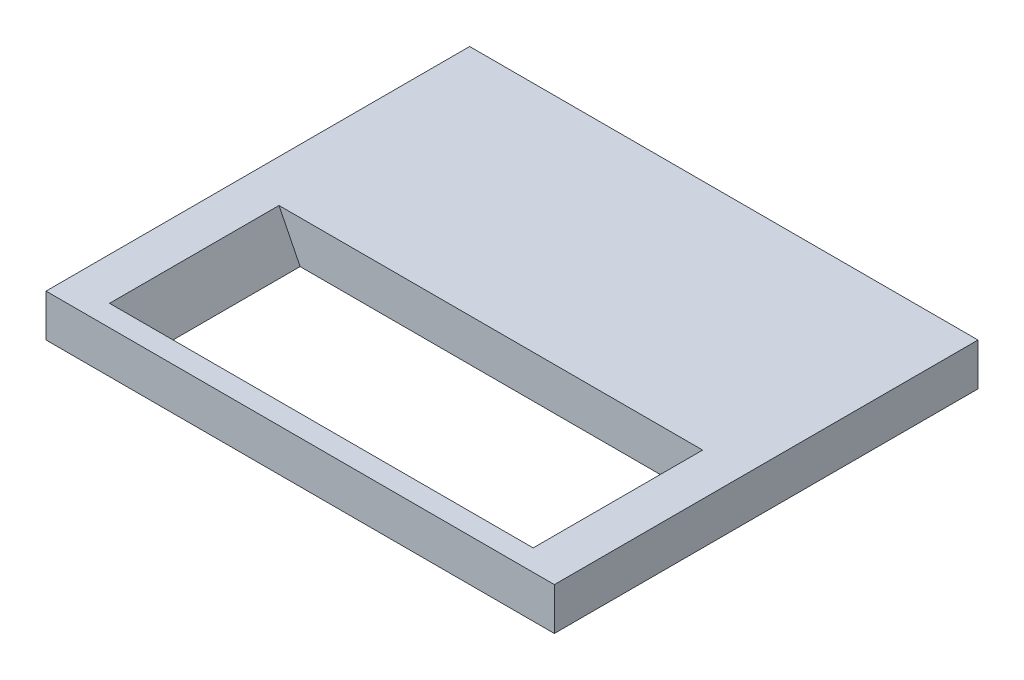
ISO-10303-21;
HEADER;
FILE_DESCRIPTION(('STEP AP214'),'2;1');
FILE_NAME('part.step','',(''),(''),'','','');
FILE_SCHEMA(('AUTOMOTIVE_DESIGN { 1 0 10303 214 1 1 1 1 }'));
ENDSEC;
DATA;
#1=APPLICATION_CONTEXT('core data for automotive mechanical design processes');
#2=APPLICATION_PROTOCOL_DEFINITION('international standard','automotive_design',2000,#1);
#3=PRODUCT_CONTEXT('',#1,'mechanical');
#4=PRODUCT('Part','Part','',(#3));
#5=PRODUCT_RELATED_PRODUCT_CATEGORY('part','',(#4));
#6=PRODUCT_DEFINITION_FORMATION('','',#4);
#7=PRODUCT_DEFINITION_CONTEXT('part definition',#1,'design');
#8=PRODUCT_DEFINITION('design','',#6,#7);
#9=PRODUCT_DEFINITION_SHAPE('','',#8);
#10=(LENGTH_UNIT() NAMED_UNIT(*) SI_UNIT(.MILLI.,.METRE.));
#11=(NAMED_UNIT(*) PLANE_ANGLE_UNIT() SI_UNIT($,.RADIAN.));
#12=(NAMED_UNIT(*) SI_UNIT($,.STERADIAN.) SOLID_ANGLE_UNIT());
#13=UNCERTAINTY_MEASURE_WITH_UNIT(LENGTH_MEASURE(1.E-05),#10,'distance_accuracy_value','');
#14=(GEOMETRIC_REPRESENTATION_CONTEXT(3) GLOBAL_UNCERTAINTY_ASSIGNED_CONTEXT((#13)) GLOBAL_UNIT_ASSIGNED_CONTEXT((#10,
#11,#12)) REPRESENTATION_CONTEXT('',''));
#15=CARTESIAN_POINT('',(0.,0.,0.));
#16=DIRECTION('',(0.,0.,1.));
#17=DIRECTION('',(1.,0.,0.));
#18=AXIS2_PLACEMENT_3D('',#15,#16,#17);
#19=CARTESIAN_POINT('',(0.,-10.,0.));
#20=DIRECTION('',(0.,1.,0.));
#21=DIRECTION('',(0.,0.,1.));
#22=AXIS2_PLACEMENT_3D('',#19,#20,#21);
#23=PLANE('',#22);
#24=DIRECTION('',(-1.,0.,0.));
#25=VECTOR('',#24,1.);
#26=CARTESIAN_POINT('',(0.,-10.,-28.));
#27=LINE('',#26,#25);
#28=CARTESIAN_POINT('',(48.,-10.,-28.));
#29=VERTEX_POINT('',#28);
#30=CARTESIAN_POINT('',(42.,-10.,-28.));
#31=VERTEX_POINT('',#30);
#32=EDGE_CURVE('E764',#29,#31,#27,.T.);
#33=ORIENTED_EDGE('',*,*,#32,.T.);
#34=DIRECTION('',(0.,0.,-1.));
#35=VECTOR('',#34,1.);
#36=CARTESIAN_POINT('',(42.,-10.,0.));
#37=LINE('',#36,#35);
#38=CARTESIAN_POINT('',(42.,-10.,-22.));
#39=VERTEX_POINT('',#38);
#40=EDGE_CURVE('E751',#39,#31,#37,.T.);
#41=ORIENTED_EDGE('',*,*,#40,.F.);
#42=DIRECTION('',(-1.,0.,0.));
#43=VECTOR('',#42,1.);
#44=CARTESIAN_POINT('',(0.,-10.,-22.));
#45=LINE('',#44,#43);
#46=CARTESIAN_POINT('',(48.,-10.,-22.));
#47=VERTEX_POINT('',#46);
#48=EDGE_CURVE('E755',#47,#39,#45,.T.);
#49=ORIENTED_EDGE('',*,*,#48,.F.);
#50=DIRECTION('',(0.,0.,-1.));
#51=VECTOR('',#50,1.);
#52=CARTESIAN_POINT('',(48.,-10.,0.));
#53=LINE('',#52,#51);
#54=EDGE_CURVE('E760',#47,#29,#53,.T.);
#55=ORIENTED_EDGE('',*,*,#54,.T.);
#56=EDGE_LOOP('',(#33,#41,#49,#55));
#57=FACE_BOUND('',#56,.T.);
#58=DIRECTION('',(1.,0.,0.));
#59=VECTOR('',#58,1.);
#60=CARTESIAN_POINT('',(0.,-10.,4.));
#61=LINE('',#60,#59);
#62=CARTESIAN_POINT('',(-49.,-10.,4.));
#63=VERTEX_POINT('',#62);
#64=CARTESIAN_POINT('',(-46.,-10.,4.));
#65=VERTEX_POINT('',#64);
#66=EDGE_CURVE('E849',#63,#65,#61,.T.);
#67=ORIENTED_EDGE('',*,*,#66,.T.);
#68=DIRECTION('',(0.,0.,-1.));
#69=VECTOR('',#68,1.);
#70=CARTESIAN_POINT('',(-46.,-10.,0.));
#71=LINE('',#70,#69);
#72=CARTESIAN_POINT('',(-46.,-10.,0.999999999999994));
#73=VERTEX_POINT('',#72);
#74=EDGE_CURVE('E836',#65,#73,#71,.T.);
#75=ORIENTED_EDGE('',*,*,#74,.T.);
#76=DIRECTION('',(1.,0.,0.));
#77=VECTOR('',#76,1.);
#78=CARTESIAN_POINT('',(0.,-10.,0.999999999999994));
#79=LINE('',#78,#77);
#80=CARTESIAN_POINT('',(-49.,-10.,0.999999999999994));
#81=VERTEX_POINT('',#80);
#82=EDGE_CURVE('E840',#81,#73,#79,.T.);
#83=ORIENTED_EDGE('',*,*,#82,.F.);
#84=DIRECTION('',(0.,0.,-1.));
#85=VECTOR('',#84,1.);
#86=CARTESIAN_POINT('',(-49.,-10.,0.));
#87=LINE('',#86,#85);
#88=EDGE_CURVE('E845',#63,#81,#87,.T.);
#89=ORIENTED_EDGE('',*,*,#88,.F.);
#90=EDGE_LOOP('',(#67,#75,#83,#89));
#91=FACE_BOUND('',#90,.T.);
#92=DIRECTION('',(1.,0.,0.));
#93=VECTOR('',#92,1.);
#94=CARTESIAN_POINT('',(-48.,-10.,-28.));
#95=LINE('',#94,#93);
#96=CARTESIAN_POINT('',(-48.,-10.,-28.));
#97=VERTEX_POINT('',#96);
#98=CARTESIAN_POINT('',(-42.,-10.,-28.));
#99=VERTEX_POINT('',#98);
#100=EDGE_CURVE('E711',#97,#99,#95,.T.);
#101=ORIENTED_EDGE('',*,*,#100,.F.);
#102=DIRECTION('',(0.,0.,-1.));
#103=VECTOR('',#102,1.);
#104=CARTESIAN_POINT('',(-48.,-10.,-22.));
#105=LINE('',#104,#103);
#106=CARTESIAN_POINT('',(-48.,-10.,-22.));
#107=VERTEX_POINT('',#106);
#108=EDGE_CURVE('E689',#107,#97,#105,.T.);
#109=ORIENTED_EDGE('',*,*,#108,.F.);
#110=DIRECTION('',(1.,0.,0.));
#111=VECTOR('',#110,1.);
#112=CARTESIAN_POINT('',(-48.,-10.,-22.));
#113=LINE('',#112,#111);
#114=CARTESIAN_POINT('',(-42.,-10.,-22.));
#115=VERTEX_POINT('',#114);
#116=EDGE_CURVE('E699',#107,#115,#113,.T.);
#117=ORIENTED_EDGE('',*,*,#116,.T.);
#118=DIRECTION('',(0.,0.,-1.));
#119=VECTOR('',#118,1.);
#120=CARTESIAN_POINT('',(-42.,-10.,-22.));
#121=LINE('',#120,#119);
#122=EDGE_CURVE('E706',#115,#99,#121,.T.);
#123=ORIENTED_EDGE('',*,*,#122,.T.);
#124=EDGE_LOOP('',(#101,#109,#117,#123));
#125=FACE_BOUND('',#124,.T.);
#126=DIRECTION('',(0.,0.,-1.));
#127=VECTOR('',#126,1.);
#128=CARTESIAN_POINT('',(-45.0141839194658,-10.,0.));
#129=LINE('',#128,#127);
#130=CARTESIAN_POINT('',(-45.0141839194658,-10.,4.99999999999999));
#131=VERTEX_POINT('',#130);
#132=CARTESIAN_POINT('',(-45.0141839194658,-10.,45.));
#133=VERTEX_POINT('',#132);
#134=EDGE_CURVE('E996',#131,#133,#129,.F.);
#135=ORIENTED_EDGE('',*,*,#134,.T.);
#136=DIRECTION('',(-1.,0.,0.));
#137=VECTOR('',#136,1.);
#138=CARTESIAN_POINT('',(0.,-10.,45.));
#139=LINE('',#138,#137);
#140=CARTESIAN_POINT('',(45.,-10.,45.));
#141=VERTEX_POINT('',#140);
#142=EDGE_CURVE('E955',#141,#133,#139,.T.);
#143=ORIENTED_EDGE('',*,*,#142,.F.);
#144=DIRECTION('',(0.,0.,1.));
#145=VECTOR('',#144,1.);
#146=CARTESIAN_POINT('',(45.,-10.,0.));
#147=LINE('',#146,#145);
#148=CARTESIAN_POINT('',(45.,-10.,4.99999999999999));
#149=VERTEX_POINT('',#148);
#150=EDGE_CURVE('E961',#149,#141,#147,.T.);
#151=ORIENTED_EDGE('',*,*,#150,.F.);
#152=DIRECTION('',(1.,0.,0.));
#153=VECTOR('',#152,1.);
#154=CARTESIAN_POINT('',(0.,-10.,4.99999999999999));
#155=LINE('',#154,#153);
#156=EDGE_CURVE('E943',#131,#149,#155,.T.);
#157=ORIENTED_EDGE('',*,*,#156,.F.);
#158=EDGE_LOOP('',(#135,#143,#151,#157));
#159=FACE_BOUND('',#158,.T.);
#160=DIRECTION('',(1.,0.,0.));
#161=VECTOR('',#160,1.);
#162=CARTESIAN_POINT('',(0.,-10.,50.));
#163=LINE('',#162,#161);
#164=CARTESIAN_POINT('',(-60.,-10.,50.));
#165=VERTEX_POINT('',#164);
#166=CARTESIAN_POINT('',(60.,-10.,50.));
#167=VERTEX_POINT('',#166);
#168=EDGE_CURVE('E970',#165,#167,#163,.T.);
#169=ORIENTED_EDGE('',*,*,#168,.F.);
#170=DIRECTION('',(0.,0.,1.));
#171=VECTOR('',#170,1.);
#172=CARTESIAN_POINT('',(-60.,-10.,0.));
#173=LINE('',#172,#171);
#174=CARTESIAN_POINT('',(-60.,-10.,-50.));
#175=VERTEX_POINT('',#174);
#176=EDGE_CURVE('E967',#175,#165,#173,.T.);
#177=ORIENTED_EDGE('',*,*,#176,.F.);
#178=DIRECTION('',(1.,0.,0.));
#179=VECTOR('',#178,1.);
#180=CARTESIAN_POINT('',(0.,-10.,-50.));
#181=LINE('',#180,#179);
#182=CARTESIAN_POINT('',(60.,-10.,-50.));
#183=VERTEX_POINT('',#182);
#184=EDGE_CURVE('E978',#175,#183,#181,.T.);
#185=ORIENTED_EDGE('',*,*,#184,.T.);
#186=DIRECTION('',(0.,0.,1.));
#187=VECTOR('',#186,1.);
#188=CARTESIAN_POINT('',(60.,-10.,0.));
#189=LINE('',#188,#187);
#190=EDGE_CURVE('E975',#183,#167,#189,.T.);
#191=ORIENTED_EDGE('',*,*,#190,.T.);
#192=EDGE_LOOP('',(#169,#177,#185,#191));
#193=FACE_BOUND('',#192,.T.);
#194=DIRECTION('',(-1.,0.,0.));
#195=VECTOR('',#194,1.);
#196=CARTESIAN_POINT('',(0.,-10.,45.9999999999999));
#197=LINE('',#196,#195);
#198=CARTESIAN_POINT('',(49.0000000000001,-10.,45.9999999999999));
#199=VERTEX_POINT('',#198);
#200=CARTESIAN_POINT('',(46.0000000000001,-10.,45.9999999999999));
#201=VERTEX_POINT('',#200);
#202=EDGE_CURVE('E853',#199,#201,#197,.T.);
#203=ORIENTED_EDGE('',*,*,#202,.T.);
#204=DIRECTION('',(0.,0.,1.));
#205=VECTOR('',#204,1.);
#206=CARTESIAN_POINT('',(46.0000000000001,-10.,0.));
#207=LINE('',#206,#205);
#208=CARTESIAN_POINT('',(46.0000000000001,-10.,48.9999999999999));
#209=VERTEX_POINT('',#208);
#210=EDGE_CURVE('E913',#201,#209,#207,.T.);
#211=ORIENTED_EDGE('',*,*,#210,.T.);
#212=DIRECTION('',(-1.,0.,0.));
#213=VECTOR('',#212,1.);
#214=CARTESIAN_POINT('',(0.,-10.,48.9999999999999));
#215=LINE('',#214,#213);
#216=CARTESIAN_POINT('',(49.0000000000001,-10.,48.9999999999999));
#217=VERTEX_POINT('',#216);
#218=EDGE_CURVE('E932',#217,#209,#215,.T.);
#219=ORIENTED_EDGE('',*,*,#218,.F.);
#220=DIRECTION('',(0.,0.,1.));
#221=VECTOR('',#220,1.);
#222=CARTESIAN_POINT('',(49.0000000000001,-10.,0.));
#223=LINE('',#222,#221);
#224=EDGE_CURVE('E928',#199,#217,#223,.T.);
#225=ORIENTED_EDGE('',*,*,#224,.F.);
#226=EDGE_LOOP('',(#203,#211,#219,#225));
#227=FACE_BOUND('',#226,.T.);
#228=DIRECTION('',(-1.,0.,0.));
#229=VECTOR('',#228,1.);
#230=CARTESIAN_POINT('',(0.,-10.,1.00000000000008));
#231=LINE('',#230,#229);
#232=CARTESIAN_POINT('',(49.0000000000001,-10.,1.00000000000008));
#233=VERTEX_POINT('',#232);
#234=CARTESIAN_POINT('',(46.0000000000001,-10.,1.00000000000008));
#235=VERTEX_POINT('',#234);
#236=EDGE_CURVE('E835',#233,#235,#231,.T.);
#237=ORIENTED_EDGE('',*,*,#236,.T.);
#238=DIRECTION('',(0.,0.,-1.));
#239=VECTOR('',#238,1.);
#240=CARTESIAN_POINT('',(46.0000000000001,-10.,0.));
#241=LINE('',#240,#239);
#242=CARTESIAN_POINT('',(46.0000000000001,-10.,4.00000000000008));
#243=VERTEX_POINT('',#242);
#244=EDGE_CURVE('E880',#243,#235,#241,.T.);
#245=ORIENTED_EDGE('',*,*,#244,.F.);
#246=DIRECTION('',(-1.,0.,0.));
#247=VECTOR('',#246,1.);
#248=CARTESIAN_POINT('',(0.,-10.,4.00000000000008));
#249=LINE('',#248,#247);
#250=CARTESIAN_POINT('',(49.0000000000001,-10.,4.00000000000008));
#251=VERTEX_POINT('',#250);
#252=EDGE_CURVE('E884',#251,#243,#249,.T.);
#253=ORIENTED_EDGE('',*,*,#252,.F.);
#254=DIRECTION('',(0.,0.,-1.));
#255=VECTOR('',#254,1.);
#256=CARTESIAN_POINT('',(49.0000000000001,-10.,0.));
#257=LINE('',#256,#255);
#258=EDGE_CURVE('E889',#251,#233,#257,.T.);
#259=ORIENTED_EDGE('',*,*,#258,.T.);
#260=EDGE_LOOP('',(#237,#245,#253,#259));
#261=FACE_BOUND('',#260,.T.);
#262=DIRECTION('',(0.,0.,1.));
#263=VECTOR('',#262,1.);
#264=CARTESIAN_POINT('',(-49.,-10.,46.));
#265=LINE('',#264,#263);
#266=CARTESIAN_POINT('',(-49.,-10.,46.));
#267=VERTEX_POINT('',#266);
#268=CARTESIAN_POINT('',(-49.,-10.,49.));
#269=VERTEX_POINT('',#268);
#270=EDGE_CURVE('E750',#267,#269,#265,.T.);
#271=ORIENTED_EDGE('',*,*,#270,.T.);
#272=DIRECTION('',(1.,0.,0.));
#273=VECTOR('',#272,1.);
#274=CARTESIAN_POINT('',(-49.,-10.,49.));
#275=LINE('',#274,#273);
#276=CARTESIAN_POINT('',(-46.,-10.,49.));
#277=VERTEX_POINT('',#276);
#278=EDGE_CURVE('E800',#269,#277,#275,.T.);
#279=ORIENTED_EDGE('',*,*,#278,.T.);
#280=DIRECTION('',(0.,0.,1.));
#281=VECTOR('',#280,1.);
#282=CARTESIAN_POINT('',(-46.,-10.,46.));
#283=LINE('',#282,#281);
#284=CARTESIAN_POINT('',(-46.,-10.,46.));
#285=VERTEX_POINT('',#284);
#286=EDGE_CURVE('E795',#285,#277,#283,.T.);
#287=ORIENTED_EDGE('',*,*,#286,.F.);
#288=DIRECTION('',(1.,0.,0.));
#289=VECTOR('',#288,1.);
#290=CARTESIAN_POINT('',(-49.,-10.,46.));
#291=LINE('',#290,#289);
#292=EDGE_CURVE('E791',#267,#285,#291,.T.);
#293=ORIENTED_EDGE('',*,*,#292,.F.);
#294=EDGE_LOOP('',(#271,#279,#287,#293));
#295=FACE_BOUND('',#294,.T.);
#296=ADVANCED_FACE('F475',(#57,#91,#125,#159,#193,#227,#261,#295),#23,.F.);
#297=CARTESIAN_POINT('',(0.,0.,0.));
#298=DIRECTION('',(0.,1.,0.));
#299=DIRECTION('',(0.,0.,1.));
#300=AXIS2_PLACEMENT_3D('',#297,#298,#299);
#301=PLANE('',#300);
#302=DIRECTION('',(0.,0.,1.));
#303=VECTOR('',#302,1.);
#304=CARTESIAN_POINT('',(-60.,0.,0.));
#305=LINE('',#304,#303);
#306=CARTESIAN_POINT('',(-60.,0.,-50.));
#307=VERTEX_POINT('',#306);
#308=CARTESIAN_POINT('',(-60.,0.,50.));
#309=VERTEX_POINT('',#308);
#310=EDGE_CURVE('E958',#307,#309,#305,.T.);
#311=ORIENTED_EDGE('',*,*,#310,.T.);
#312=DIRECTION('',(1.,0.,0.));
#313=VECTOR('',#312,1.);
#314=CARTESIAN_POINT('',(0.,0.,50.));
#315=LINE('',#314,#313);
#316=CARTESIAN_POINT('',(60.,0.,50.));
#317=VERTEX_POINT('',#316);
#318=EDGE_CURVE('E984',#309,#317,#315,.T.);
#319=ORIENTED_EDGE('',*,*,#318,.T.);
#320=DIRECTION('',(0.,0.,1.));
#321=VECTOR('',#320,1.);
#322=CARTESIAN_POINT('',(60.,0.,0.));
#323=LINE('',#322,#321);
#324=CARTESIAN_POINT('',(60.,0.,-50.));
#325=VERTEX_POINT('',#324);
#326=EDGE_CURVE('E987',#325,#317,#323,.T.);
#327=ORIENTED_EDGE('',*,*,#326,.F.);
#328=DIRECTION('',(1.,0.,0.));
#329=VECTOR('',#328,1.);
#330=CARTESIAN_POINT('',(0.,0.,-50.));
#331=LINE('',#330,#329);
#332=EDGE_CURVE('E971',#307,#325,#331,.T.);
#333=ORIENTED_EDGE('',*,*,#332,.F.);
#334=EDGE_LOOP('',(#311,#319,#327,#333));
#335=FACE_BOUND('',#334,.T.);
#336=DIRECTION('',(0.,0.,1.));
#337=VECTOR('',#336,1.);
#338=CARTESIAN_POINT('',(49.9999888348986,0.,45.));
#339=LINE('',#338,#337);
#340=CARTESIAN_POINT('',(49.9999888348986,0.,4.99999999999999));
#341=VERTEX_POINT('',#340);
#342=CARTESIAN_POINT('',(49.9999888348986,0.,45.));
#343=VERTEX_POINT('',#342);
#344=EDGE_CURVE('E1021',#341,#343,#339,.T.);
#345=ORIENTED_EDGE('',*,*,#344,.T.);
#346=DIRECTION('',(-1.,0.,0.));
#347=VECTOR('',#346,1.);
#348=CARTESIAN_POINT('',(0.,0.,45.));
#349=LINE('',#348,#347);
#350=CARTESIAN_POINT('',(-50.0000000000001,0.,45.));
#351=VERTEX_POINT('',#350);
#352=EDGE_CURVE('E492',#343,#351,#349,.T.);
#353=ORIENTED_EDGE('',*,*,#352,.T.);
#354=DIRECTION('',(0.,0.,-1.));
#355=VECTOR('',#354,1.);
#356=CARTESIAN_POINT('',(-50.0000000000001,0.,0.));
#357=LINE('',#356,#355);
#358=CARTESIAN_POINT('',(-50.0000000000001,0.,4.99999999999999));
#359=VERTEX_POINT('',#358);
#360=EDGE_CURVE('E1011',#351,#359,#357,.T.);
#361=ORIENTED_EDGE('',*,*,#360,.T.);
#362=DIRECTION('',(1.,0.,0.));
#363=VECTOR('',#362,1.);
#364=CARTESIAN_POINT('',(0.,0.,4.99999999999999));
#365=LINE('',#364,#363);
#366=EDGE_CURVE('E500',#359,#341,#365,.T.);
#367=ORIENTED_EDGE('',*,*,#366,.T.);
#368=EDGE_LOOP('',(#345,#353,#361,#367));
#369=FACE_BOUND('',#368,.T.);
#370=ADVANCED_FACE('F1039',(#335,#369),#301,.T.);
#371=CARTESIAN_POINT('',(0.,-10.,-50.));
#372=DIRECTION('',(0.,0.,1.));
#373=DIRECTION('',(1.,0.,0.));
#374=AXIS2_PLACEMENT_3D('',#371,#372,#373);
#375=PLANE('',#374);
#376=ORIENTED_EDGE('',*,*,#332,.T.);
#377=DIRECTION('',(0.,1.,0.));
#378=VECTOR('',#377,1.);
#379=CARTESIAN_POINT('',(60.,-10.,-50.));
#380=LINE('',#379,#378);
#381=EDGE_CURVE('E997',#183,#325,#380,.T.);
#382=ORIENTED_EDGE('',*,*,#381,.F.);
#383=ORIENTED_EDGE('',*,*,#184,.F.);
#384=DIRECTION('',(0.,1.,0.));
#385=VECTOR('',#384,1.);
#386=CARTESIAN_POINT('',(-60.,-10.,-50.));
#387=LINE('',#386,#385);
#388=EDGE_CURVE('E993',#175,#307,#387,.T.);
#389=ORIENTED_EDGE('',*,*,#388,.T.);
#390=EDGE_LOOP('',(#376,#382,#383,#389));
#391=FACE_BOUND('',#390,.T.);
#392=ADVANCED_FACE('F1041',(#391),#375,.F.);
#393=CARTESIAN_POINT('',(-60.,-10.,0.));
#394=DIRECTION('',(-1.,0.,0.));
#395=DIRECTION('',(0.,0.,1.));
#396=AXIS2_PLACEMENT_3D('',#393,#394,#395);
#397=PLANE('',#396);
#398=DIRECTION('',(0.,1.,0.));
#399=VECTOR('',#398,1.);
#400=CARTESIAN_POINT('',(-60.,-10.,50.));
#401=LINE('',#400,#399);
#402=EDGE_CURVE('E981',#165,#309,#401,.T.);
#403=ORIENTED_EDGE('',*,*,#402,.T.);
#404=ORIENTED_EDGE('',*,*,#310,.F.);
#405=ORIENTED_EDGE('',*,*,#388,.F.);
#406=ORIENTED_EDGE('',*,*,#176,.T.);
#407=EDGE_LOOP('',(#403,#404,#405,#406));
#408=FACE_BOUND('',#407,.T.);
#409=ADVANCED_FACE('F1048',(#408),#397,.T.);
#410=CARTESIAN_POINT('',(60.,-10.,0.));
#411=DIRECTION('',(-1.,0.,0.));
#412=DIRECTION('',(0.,0.,1.));
#413=AXIS2_PLACEMENT_3D('',#410,#411,#412);
#414=PLANE('',#413);
#415=DIRECTION('',(0.,1.,0.));
#416=VECTOR('',#415,1.);
#417=CARTESIAN_POINT('',(60.,-10.,50.));
#418=LINE('',#417,#416);
#419=EDGE_CURVE('E1001',#167,#317,#418,.T.);
#420=ORIENTED_EDGE('',*,*,#419,.F.);
#421=ORIENTED_EDGE('',*,*,#190,.F.);
#422=ORIENTED_EDGE('',*,*,#381,.T.);
#423=ORIENTED_EDGE('',*,*,#326,.T.);
#424=EDGE_LOOP('',(#420,#421,#422,#423));
#425=FACE_BOUND('',#424,.T.);
#426=ADVANCED_FACE('F1055',(#425),#414,.F.);
#427=CARTESIAN_POINT('',(0.,-10.,50.));
#428=DIRECTION('',(0.,0.,1.));
#429=DIRECTION('',(1.,0.,0.));
#430=AXIS2_PLACEMENT_3D('',#427,#428,#429);
#431=PLANE('',#430);
#432=ORIENTED_EDGE('',*,*,#419,.T.);
#433=ORIENTED_EDGE('',*,*,#318,.F.);
#434=ORIENTED_EDGE('',*,*,#402,.F.);
#435=ORIENTED_EDGE('',*,*,#168,.T.);
#436=EDGE_LOOP('',(#432,#433,#434,#435));
#437=FACE_BOUND('',#436,.T.);
#438=ADVANCED_FACE('F1058',(#437),#431,.T.);
#439=CARTESIAN_POINT('',(0.,0.,45.));
#440=DIRECTION('',(0.,0.,1.));
#441=DIRECTION('',(1.,0.,0.));
#442=AXIS2_PLACEMENT_3D('',#439,#440,#441);
#443=PLANE('',#442);
#444=ORIENTED_EDGE('',*,*,#142,.T.);
#445=DIRECTION('',(0.446197813109805,-0.894934361602027,0.));
#446=VECTOR('',#445,1.);
#447=CARTESIAN_POINT('',(-40.0453755788014,-19.9658877511822,45.));
#448=LINE('',#447,#446);
#449=EDGE_CURVE('E1014',#133,#351,#448,.F.);
#450=ORIENTED_EDGE('',*,*,#449,.T.);
#451=ORIENTED_EDGE('',*,*,#352,.F.);
#452=DIRECTION('',(-0.447212796589796,-0.894427590454551,0.));
#453=VECTOR('',#452,1.);
#454=CARTESIAN_POINT('',(40.0000267962276,-19.9999687376781,45.));
#455=LINE('',#454,#453);
#456=EDGE_CURVE('E485',#343,#141,#455,.T.);
#457=ORIENTED_EDGE('',*,*,#456,.T.);
#458=EDGE_LOOP('',(#444,#450,#451,#457));
#459=FACE_BOUND('',#458,.T.);
#460=ADVANCED_FACE('F1025',(#459),#443,.F.);
#461=CARTESIAN_POINT('',(0.,0.,4.99999999999999));
#462=DIRECTION('',(0.,0.,-1.));
#463=DIRECTION('',(-1.,0.,0.));
#464=AXIS2_PLACEMENT_3D('',#461,#462,#463);
#465=PLANE('',#464);
#466=ORIENTED_EDGE('',*,*,#156,.T.);
#467=DIRECTION('',(0.447212796589796,0.894427590454551,0.));
#468=VECTOR('',#467,1.);
#469=CARTESIAN_POINT('',(40.0000267962276,-19.9999687376781,4.99999999999999));
#470=LINE('',#469,#468);
#471=EDGE_CURVE('E12',#149,#341,#470,.T.);
#472=ORIENTED_EDGE('',*,*,#471,.T.);
#473=ORIENTED_EDGE('',*,*,#366,.F.);
#474=DIRECTION('',(-0.446197813109805,0.894934361602027,0.));
#475=VECTOR('',#474,1.);
#476=CARTESIAN_POINT('',(-40.0453755788014,-19.9658877511822,4.99999999999999));
#477=LINE('',#476,#475);
#478=EDGE_CURVE('E1017',#359,#131,#477,.F.);
#479=ORIENTED_EDGE('',*,*,#478,.T.);
#480=EDGE_LOOP('',(#466,#472,#473,#479));
#481=FACE_BOUND('',#480,.T.);
#482=ADVANCED_FACE('F1034',(#481),#465,.F.);
#483=CARTESIAN_POINT('',(0.,-4.,45.9999999999999));
#484=DIRECTION('',(0.,0.,1.));
#485=DIRECTION('',(1.,0.,0.));
#486=AXIS2_PLACEMENT_3D('',#483,#484,#485);
#487=PLANE('',#486);
#488=ORIENTED_EDGE('',*,*,#202,.F.);
#489=DIRECTION('',(0.,-1.,0.));
#490=VECTOR('',#489,1.);
#491=CARTESIAN_POINT('',(49.0000000000001,-4.,45.9999999999999));
#492=LINE('',#491,#490);
#493=CARTESIAN_POINT('',(49.0000000000001,-4.,45.9999999999999));
#494=VERTEX_POINT('',#493);
#495=EDGE_CURVE('E924',#494,#199,#492,.T.);
#496=ORIENTED_EDGE('',*,*,#495,.F.);
#497=DIRECTION('',(-1.,0.,0.));
#498=VECTOR('',#497,1.);
#499=CARTESIAN_POINT('',(0.,-4.,45.9999999999999));
#500=LINE('',#499,#498);
#501=CARTESIAN_POINT('',(46.0000000000001,-4.,45.9999999999999));
#502=VERTEX_POINT('',#501);
#503=EDGE_CURVE('E908',#494,#502,#500,.T.);
#504=ORIENTED_EDGE('',*,*,#503,.T.);
#505=DIRECTION('',(0.,-1.,0.));
#506=VECTOR('',#505,1.);
#507=CARTESIAN_POINT('',(46.0000000000001,-4.,45.9999999999999));
#508=LINE('',#507,#506);
#509=EDGE_CURVE('E939',#502,#201,#508,.T.);
#510=ORIENTED_EDGE('',*,*,#509,.T.);
#511=EDGE_LOOP('',(#488,#496,#504,#510));
#512=FACE_BOUND('',#511,.T.);
#513=ADVANCED_FACE('F1137',(#512),#487,.T.);
#514=CARTESIAN_POINT('',(46.0000000000001,-4.,0.));
#515=DIRECTION('',(1.,0.,0.));
#516=DIRECTION('',(0.,0.,-1.));
#517=AXIS2_PLACEMENT_3D('',#514,#515,#516);
#518=PLANE('',#517);
#519=ORIENTED_EDGE('',*,*,#210,.F.);
#520=ORIENTED_EDGE('',*,*,#509,.F.);
#521=DIRECTION('',(0.,0.,1.));
#522=VECTOR('',#521,1.);
#523=CARTESIAN_POINT('',(46.0000000000001,-4.,0.));
#524=LINE('',#523,#522);
#525=CARTESIAN_POINT('',(46.0000000000001,-4.,48.9999999999999));
#526=VERTEX_POINT('',#525);
#527=EDGE_CURVE('E921',#502,#526,#524,.T.);
#528=ORIENTED_EDGE('',*,*,#527,.T.);
#529=DIRECTION('',(0.,-1.,0.));
#530=VECTOR('',#529,1.);
#531=CARTESIAN_POINT('',(46.0000000000001,-4.,48.9999999999999));
#532=LINE('',#531,#530);
#533=EDGE_CURVE('E944',#526,#209,#532,.T.);
#534=ORIENTED_EDGE('',*,*,#533,.T.);
#535=EDGE_LOOP('',(#519,#520,#528,#534));
#536=FACE_BOUND('',#535,.T.);
#537=ADVANCED_FACE('F1133',(#536),#518,.T.);
#538=CARTESIAN_POINT('',(0.,-4.,48.9999999999999));
#539=DIRECTION('',(0.,0.,1.));
#540=DIRECTION('',(1.,0.,0.));
#541=AXIS2_PLACEMENT_3D('',#538,#539,#540);
#542=PLANE('',#541);
#543=ORIENTED_EDGE('',*,*,#218,.T.);
#544=ORIENTED_EDGE('',*,*,#533,.F.);
#545=DIRECTION('',(-1.,0.,0.));
#546=VECTOR('',#545,1.);
#547=CARTESIAN_POINT('',(0.,-4.,48.9999999999999));
#548=LINE('',#547,#546);
#549=CARTESIAN_POINT('',(49.0000000000001,-4.,48.9999999999999));
#550=VERTEX_POINT('',#549);
#551=EDGE_CURVE('E917',#550,#526,#548,.T.);
#552=ORIENTED_EDGE('',*,*,#551,.F.);
#553=DIRECTION('',(0.,-1.,0.));
#554=VECTOR('',#553,1.);
#555=CARTESIAN_POINT('',(49.0000000000001,-4.,48.9999999999999));
#556=LINE('',#555,#554);
#557=EDGE_CURVE('E947',#550,#217,#556,.T.);
#558=ORIENTED_EDGE('',*,*,#557,.T.);
#559=EDGE_LOOP('',(#543,#544,#552,#558));
#560=FACE_BOUND('',#559,.T.);
#561=ADVANCED_FACE('F1136',(#560),#542,.F.);
#562=CARTESIAN_POINT('',(49.0000000000001,-4.,0.));
#563=DIRECTION('',(1.,0.,0.));
#564=DIRECTION('',(0.,0.,-1.));
#565=AXIS2_PLACEMENT_3D('',#562,#563,#564);
#566=PLANE('',#565);
#567=ORIENTED_EDGE('',*,*,#224,.T.);
#568=ORIENTED_EDGE('',*,*,#557,.F.);
#569=DIRECTION('',(0.,0.,1.));
#570=VECTOR('',#569,1.);
#571=CARTESIAN_POINT('',(49.0000000000001,-4.,0.));
#572=LINE('',#571,#570);
#573=EDGE_CURVE('E912',#494,#550,#572,.T.);
#574=ORIENTED_EDGE('',*,*,#573,.F.);
#575=ORIENTED_EDGE('',*,*,#495,.T.);
#576=EDGE_LOOP('',(#567,#568,#574,#575));
#577=FACE_BOUND('',#576,.T.);
#578=ADVANCED_FACE('F1131',(#577),#566,.F.);
#579=CARTESIAN_POINT('',(0.,-4.,0.));
#580=DIRECTION('',(0.,-1.,0.));
#581=DIRECTION('',(0.,0.,-1.));
#582=AXIS2_PLACEMENT_3D('',#579,#580,#581);
#583=PLANE('',#582);
#584=ORIENTED_EDGE('',*,*,#503,.F.);
#585=ORIENTED_EDGE('',*,*,#573,.T.);
#586=ORIENTED_EDGE('',*,*,#551,.T.);
#587=ORIENTED_EDGE('',*,*,#527,.F.);
#588=EDGE_LOOP('',(#584,#585,#586,#587));
#589=FACE_BOUND('',#588,.T.);
#590=ADVANCED_FACE('F1128',(#589),#583,.T.);
#591=CARTESIAN_POINT('',(-48.,-4.,-22.));
#592=DIRECTION('',(-1.,0.,0.));
#593=DIRECTION('',(0.,0.,1.));
#594=AXIS2_PLACEMENT_3D('',#591,#592,#593);
#595=PLANE('',#594);
#596=ORIENTED_EDGE('',*,*,#108,.T.);
#597=DIRECTION('',(0.,-1.,0.));
#598=VECTOR('',#597,1.);
#599=CARTESIAN_POINT('',(-48.,-4.,-28.));
#600=LINE('',#599,#598);
#601=CARTESIAN_POINT('',(-48.,-4.,-28.));
#602=VERTEX_POINT('',#601);
#603=EDGE_CURVE('E727',#602,#97,#600,.T.);
#604=ORIENTED_EDGE('',*,*,#603,.F.);
#605=DIRECTION('',(0.,0.,-1.));
#606=VECTOR('',#605,1.);
#607=CARTESIAN_POINT('',(-48.,-4.,-22.));
#608=LINE('',#607,#606);
#609=CARTESIAN_POINT('',(-48.,-4.,-22.));
#610=VERTEX_POINT('',#609);
#611=EDGE_CURVE('E692',#610,#602,#608,.T.);
#612=ORIENTED_EDGE('',*,*,#611,.F.);
#613=DIRECTION('',(0.,-1.,0.));
#614=VECTOR('',#613,1.);
#615=CARTESIAN_POINT('',(-48.,-4.,-22.));
#616=LINE('',#615,#614);
#617=EDGE_CURVE('E685',#610,#107,#616,.T.);
#618=ORIENTED_EDGE('',*,*,#617,.T.);
#619=EDGE_LOOP('',(#596,#604,#612,#618));
#620=FACE_BOUND('',#619,.T.);
#621=ADVANCED_FACE('F687',(#620),#595,.F.);
#622=CARTESIAN_POINT('',(-48.,-4.,-22.));
#623=DIRECTION('',(0.,0.,-1.));
#624=DIRECTION('',(-1.,0.,0.));
#625=AXIS2_PLACEMENT_3D('',#622,#623,#624);
#626=PLANE('',#625);
#627=ORIENTED_EDGE('',*,*,#116,.F.);
#628=ORIENTED_EDGE('',*,*,#617,.F.);
#629=DIRECTION('',(1.,0.,0.));
#630=VECTOR('',#629,1.);
#631=CARTESIAN_POINT('',(-48.,-4.,-22.));
#632=LINE('',#631,#630);
#633=CARTESIAN_POINT('',(-42.,-4.,-22.));
#634=VERTEX_POINT('',#633);
#635=EDGE_CURVE('E723',#610,#634,#632,.T.);
#636=ORIENTED_EDGE('',*,*,#635,.T.);
#637=DIRECTION('',(0.,-1.,0.));
#638=VECTOR('',#637,1.);
#639=CARTESIAN_POINT('',(-42.,-4.,-22.));
#640=LINE('',#639,#638);
#641=EDGE_CURVE('E696',#634,#115,#640,.T.);
#642=ORIENTED_EDGE('',*,*,#641,.T.);
#643=EDGE_LOOP('',(#627,#628,#636,#642));
#644=FACE_BOUND('',#643,.T.);
#645=ADVANCED_FACE('F700',(#644),#626,.T.);
#646=CARTESIAN_POINT('',(-42.,-4.,-22.));
#647=DIRECTION('',(-1.,0.,0.));
#648=DIRECTION('',(0.,0.,1.));
#649=AXIS2_PLACEMENT_3D('',#646,#647,#648);
#650=PLANE('',#649);
#651=ORIENTED_EDGE('',*,*,#122,.F.);
#652=ORIENTED_EDGE('',*,*,#641,.F.);
#653=DIRECTION('',(0.,0.,-1.));
#654=VECTOR('',#653,1.);
#655=CARTESIAN_POINT('',(-42.,-4.,-22.));
#656=LINE('',#655,#654);
#657=CARTESIAN_POINT('',(-42.,-4.,-28.));
#658=VERTEX_POINT('',#657);
#659=EDGE_CURVE('E726',#634,#658,#656,.T.);
#660=ORIENTED_EDGE('',*,*,#659,.T.);
#661=DIRECTION('',(0.,-1.,0.));
#662=VECTOR('',#661,1.);
#663=CARTESIAN_POINT('',(-42.,-4.,-28.));
#664=LINE('',#663,#662);
#665=EDGE_CURVE('E1633',#658,#99,#664,.T.);
#666=ORIENTED_EDGE('',*,*,#665,.T.);
#667=EDGE_LOOP('',(#651,#652,#660,#666));
#668=FACE_BOUND('',#667,.T.);
#669=ADVANCED_FACE('F1188',(#668),#650,.T.);
#670=CARTESIAN_POINT('',(-48.,-4.,-28.));
#671=DIRECTION('',(0.,0.,-1.));
#672=DIRECTION('',(-1.,0.,0.));
#673=AXIS2_PLACEMENT_3D('',#670,#671,#672);
#674=PLANE('',#673);
#675=ORIENTED_EDGE('',*,*,#100,.T.);
#676=ORIENTED_EDGE('',*,*,#665,.F.);
#677=DIRECTION('',(1.,0.,0.));
#678=VECTOR('',#677,1.);
#679=CARTESIAN_POINT('',(-48.,-4.,-28.));
#680=LINE('',#679,#678);
#681=EDGE_CURVE('E730',#602,#658,#680,.T.);
#682=ORIENTED_EDGE('',*,*,#681,.F.);
#683=ORIENTED_EDGE('',*,*,#603,.T.);
#684=EDGE_LOOP('',(#675,#676,#682,#683));
#685=FACE_BOUND('',#684,.T.);
#686=ADVANCED_FACE('F1195',(#685),#674,.F.);
#687=CARTESIAN_POINT('',(0.,-4.,0.));
#688=DIRECTION('',(0.,-1.,0.));
#689=DIRECTION('',(0.,0.,-1.));
#690=AXIS2_PLACEMENT_3D('',#687,#688,#689);
#691=PLANE('',#690);
#692=ORIENTED_EDGE('',*,*,#611,.T.);
#693=ORIENTED_EDGE('',*,*,#681,.T.);
#694=ORIENTED_EDGE('',*,*,#659,.F.);
#695=ORIENTED_EDGE('',*,*,#635,.F.);
#696=EDGE_LOOP('',(#692,#693,#694,#695));
#697=FACE_BOUND('',#696,.T.);
#698=ADVANCED_FACE('F1090',(#697),#691,.T.);
#699=CARTESIAN_POINT('',(0.,-4.,4.));
#700=DIRECTION('',(0.,0.,-1.));
#701=DIRECTION('',(-1.,0.,0.));
#702=AXIS2_PLACEMENT_3D('',#699,#700,#701);
#703=PLANE('',#702);
#704=ORIENTED_EDGE('',*,*,#66,.F.);
#705=DIRECTION('',(0.,-1.,0.));
#706=VECTOR('',#705,1.);
#707=CARTESIAN_POINT('',(-49.,-4.,4.));
#708=LINE('',#707,#706);
#709=CARTESIAN_POINT('',(-49.,-4.,4.));
#710=VERTEX_POINT('',#709);
#711=EDGE_CURVE('E820',#710,#63,#708,.T.);
#712=ORIENTED_EDGE('',*,*,#711,.F.);
#713=DIRECTION('',(1.,0.,0.));
#714=VECTOR('',#713,1.);
#715=CARTESIAN_POINT('',(0.,-4.,4.));
#716=LINE('',#715,#714);
#717=CARTESIAN_POINT('',(-46.,-4.,4.));
#718=VERTEX_POINT('',#717);
#719=EDGE_CURVE('E841',#710,#718,#716,.T.);
#720=ORIENTED_EDGE('',*,*,#719,.T.);
#721=DIRECTION('',(0.,-1.,0.));
#722=VECTOR('',#721,1.);
#723=CARTESIAN_POINT('',(-46.,-4.,4.));
#724=LINE('',#723,#722);
#725=EDGE_CURVE('E831',#718,#65,#724,.T.);
#726=ORIENTED_EDGE('',*,*,#725,.T.);
#727=EDGE_LOOP('',(#704,#712,#720,#726));
#728=FACE_BOUND('',#727,.T.);
#729=ADVANCED_FACE('F1086',(#728),#703,.T.);
#730=CARTESIAN_POINT('',(-46.,-4.,0.));
#731=DIRECTION('',(-1.,0.,0.));
#732=DIRECTION('',(0.,0.,1.));
#733=AXIS2_PLACEMENT_3D('',#730,#731,#732);
#734=PLANE('',#733);
#735=ORIENTED_EDGE('',*,*,#74,.F.);
#736=ORIENTED_EDGE('',*,*,#725,.F.);
#737=DIRECTION('',(0.,0.,-1.));
#738=VECTOR('',#737,1.);
#739=CARTESIAN_POINT('',(-46.,-4.,0.));
#740=LINE('',#739,#738);
#741=CARTESIAN_POINT('',(-46.,-4.,0.999999999999994));
#742=VERTEX_POINT('',#741);
#743=EDGE_CURVE('E824',#718,#742,#740,.T.);
#744=ORIENTED_EDGE('',*,*,#743,.T.);
#745=DIRECTION('',(0.,-1.,0.));
#746=VECTOR('',#745,1.);
#747=CARTESIAN_POINT('',(-46.,-4.,0.999999999999994));
#748=LINE('',#747,#746);
#749=EDGE_CURVE('E828',#742,#73,#748,.T.);
#750=ORIENTED_EDGE('',*,*,#749,.T.);
#751=EDGE_LOOP('',(#735,#736,#744,#750));
#752=FACE_BOUND('',#751,.T.);
#753=ADVANCED_FACE('F1089',(#752),#734,.T.);
#754=CARTESIAN_POINT('',(0.,-4.,0.999999999999994));
#755=DIRECTION('',(0.,0.,-1.));
#756=DIRECTION('',(-1.,0.,0.));
#757=AXIS2_PLACEMENT_3D('',#754,#755,#756);
#758=PLANE('',#757);
#759=ORIENTED_EDGE('',*,*,#82,.T.);
#760=ORIENTED_EDGE('',*,*,#749,.F.);
#761=DIRECTION('',(1.,0.,0.));
#762=VECTOR('',#761,1.);
#763=CARTESIAN_POINT('',(0.,-4.,0.999999999999994));
#764=LINE('',#763,#762);
#765=CARTESIAN_POINT('',(-49.,-4.,0.999999999999994));
#766=VERTEX_POINT('',#765);
#767=EDGE_CURVE('E856',#766,#742,#764,.T.);
#768=ORIENTED_EDGE('',*,*,#767,.F.);
#769=DIRECTION('',(0.,-1.,0.));
#770=VECTOR('',#769,1.);
#771=CARTESIAN_POINT('',(-49.,-4.,0.999999999999994));
#772=LINE('',#771,#770);
#773=EDGE_CURVE('E825',#766,#81,#772,.T.);
#774=ORIENTED_EDGE('',*,*,#773,.T.);
#775=EDGE_LOOP('',(#759,#760,#768,#774));
#776=FACE_BOUND('',#775,.T.);
#777=ADVANCED_FACE('F1096',(#776),#758,.F.);
#778=CARTESIAN_POINT('',(-49.,-4.,0.));
#779=DIRECTION('',(-1.,0.,0.));
#780=DIRECTION('',(0.,0.,1.));
#781=AXIS2_PLACEMENT_3D('',#778,#779,#780);
#782=PLANE('',#781);
#783=ORIENTED_EDGE('',*,*,#88,.T.);
#784=ORIENTED_EDGE('',*,*,#773,.F.);
#785=DIRECTION('',(0.,0.,-1.));
#786=VECTOR('',#785,1.);
#787=CARTESIAN_POINT('',(-49.,-4.,0.));
#788=LINE('',#787,#786);
#789=EDGE_CURVE('E860',#710,#766,#788,.T.);
#790=ORIENTED_EDGE('',*,*,#789,.F.);
#791=ORIENTED_EDGE('',*,*,#711,.T.);
#792=EDGE_LOOP('',(#783,#784,#790,#791));
#793=FACE_BOUND('',#792,.T.);
#794=ADVANCED_FACE('F1092',(#793),#782,.F.);
#795=CARTESIAN_POINT('',(0.,-4.,0.));
#796=DIRECTION('',(0.,-1.,0.));
#797=DIRECTION('',(0.,0.,-1.));
#798=AXIS2_PLACEMENT_3D('',#795,#796,#797);
#799=PLANE('',#798);
#800=ORIENTED_EDGE('',*,*,#719,.F.);
#801=ORIENTED_EDGE('',*,*,#789,.T.);
#802=ORIENTED_EDGE('',*,*,#767,.T.);
#803=ORIENTED_EDGE('',*,*,#743,.F.);
#804=EDGE_LOOP('',(#800,#801,#802,#803));
#805=FACE_BOUND('',#804,.T.);
#806=ADVANCED_FACE('F1095',(#805),#799,.T.);
#807=CARTESIAN_POINT('',(0.,-4.,1.00000000000008));
#808=DIRECTION('',(0.,0.,1.));
#809=DIRECTION('',(1.,0.,0.));
#810=AXIS2_PLACEMENT_3D('',#807,#808,#809);
#811=PLANE('',#810);
#812=ORIENTED_EDGE('',*,*,#236,.F.);
#813=DIRECTION('',(0.,-1.,0.));
#814=VECTOR('',#813,1.);
#815=CARTESIAN_POINT('',(49.0000000000001,-4.,1.00000000000008));
#816=LINE('',#815,#814);
#817=CARTESIAN_POINT('',(49.0000000000001,-4.,1.00000000000008));
#818=VERTEX_POINT('',#817);
#819=EDGE_CURVE('E867',#818,#233,#816,.T.);
#820=ORIENTED_EDGE('',*,*,#819,.F.);
#821=DIRECTION('',(-1.,0.,0.));
#822=VECTOR('',#821,1.);
#823=CARTESIAN_POINT('',(0.,-4.,1.00000000000008));
#824=LINE('',#823,#822);
#825=CARTESIAN_POINT('',(46.0000000000001,-4.,1.00000000000008));
#826=VERTEX_POINT('',#825);
#827=EDGE_CURVE('E885',#818,#826,#824,.T.);
#828=ORIENTED_EDGE('',*,*,#827,.T.);
#829=DIRECTION('',(0.,-1.,0.));
#830=VECTOR('',#829,1.);
#831=CARTESIAN_POINT('',(46.0000000000001,-4.,1.00000000000008));
#832=LINE('',#831,#830);
#833=EDGE_CURVE('E768',#826,#235,#832,.T.);
#834=ORIENTED_EDGE('',*,*,#833,.T.);
#835=EDGE_LOOP('',(#812,#820,#828,#834));
#836=FACE_BOUND('',#835,.T.);
#837=ADVANCED_FACE('F1106',(#836),#811,.T.);
#838=CARTESIAN_POINT('',(46.0000000000001,-4.,0.));
#839=DIRECTION('',(-1.,0.,0.));
#840=DIRECTION('',(0.,0.,1.));
#841=AXIS2_PLACEMENT_3D('',#838,#839,#840);
#842=PLANE('',#841);
#843=ORIENTED_EDGE('',*,*,#244,.T.);
#844=ORIENTED_EDGE('',*,*,#833,.F.);
#845=DIRECTION('',(0.,0.,-1.));
#846=VECTOR('',#845,1.);
#847=CARTESIAN_POINT('',(46.0000000000001,-4.,0.));
#848=LINE('',#847,#846);
#849=CARTESIAN_POINT('',(46.0000000000001,-4.,4.00000000000008));
#850=VERTEX_POINT('',#849);
#851=EDGE_CURVE('E871',#850,#826,#848,.T.);
#852=ORIENTED_EDGE('',*,*,#851,.F.);
#853=DIRECTION('',(0.,-1.,0.));
#854=VECTOR('',#853,1.);
#855=CARTESIAN_POINT('',(46.0000000000001,-4.,4.00000000000008));
#856=LINE('',#855,#854);
#857=EDGE_CURVE('E875',#850,#243,#856,.T.);
#858=ORIENTED_EDGE('',*,*,#857,.T.);
#859=EDGE_LOOP('',(#843,#844,#852,#858));
#860=FACE_BOUND('',#859,.T.);
#861=ADVANCED_FACE('F1110',(#860),#842,.F.);
#862=CARTESIAN_POINT('',(0.,-4.,4.00000000000008));
#863=DIRECTION('',(0.,0.,1.));
#864=DIRECTION('',(1.,0.,0.));
#865=AXIS2_PLACEMENT_3D('',#862,#863,#864);
#866=PLANE('',#865);
#867=ORIENTED_EDGE('',*,*,#252,.T.);
#868=ORIENTED_EDGE('',*,*,#857,.F.);
#869=DIRECTION('',(-1.,0.,0.));
#870=VECTOR('',#869,1.);
#871=CARTESIAN_POINT('',(0.,-4.,4.00000000000008));
#872=LINE('',#871,#870);
#873=CARTESIAN_POINT('',(49.0000000000001,-4.,4.00000000000008));
#874=VERTEX_POINT('',#873);
#875=EDGE_CURVE('E899',#874,#850,#872,.T.);
#876=ORIENTED_EDGE('',*,*,#875,.F.);
#877=DIRECTION('',(0.,-1.,0.));
#878=VECTOR('',#877,1.);
#879=CARTESIAN_POINT('',(49.0000000000001,-4.,4.00000000000008));
#880=LINE('',#879,#878);
#881=EDGE_CURVE('E872',#874,#251,#880,.T.);
#882=ORIENTED_EDGE('',*,*,#881,.T.);
#883=EDGE_LOOP('',(#867,#868,#876,#882));
#884=FACE_BOUND('',#883,.T.);
#885=ADVANCED_FACE('F1116',(#884),#866,.F.);
#886=CARTESIAN_POINT('',(49.0000000000001,-4.,0.));
#887=DIRECTION('',(-1.,0.,0.));
#888=DIRECTION('',(0.,0.,1.));
#889=AXIS2_PLACEMENT_3D('',#886,#887,#888);
#890=PLANE('',#889);
#891=ORIENTED_EDGE('',*,*,#258,.F.);
#892=ORIENTED_EDGE('',*,*,#881,.F.);
#893=DIRECTION('',(0.,0.,-1.));
#894=VECTOR('',#893,1.);
#895=CARTESIAN_POINT('',(49.0000000000001,-4.,0.));
#896=LINE('',#895,#894);
#897=EDGE_CURVE('E903',#874,#818,#896,.T.);
#898=ORIENTED_EDGE('',*,*,#897,.T.);
#899=ORIENTED_EDGE('',*,*,#819,.T.);
#900=EDGE_LOOP('',(#891,#892,#898,#899));
#901=FACE_BOUND('',#900,.T.);
#902=ADVANCED_FACE('F1112',(#901),#890,.T.);
#903=CARTESIAN_POINT('',(0.,-4.,0.));
#904=DIRECTION('',(0.,-1.,0.));
#905=DIRECTION('',(0.,0.,-1.));
#906=AXIS2_PLACEMENT_3D('',#903,#904,#905);
#907=PLANE('',#906);
#908=ORIENTED_EDGE('',*,*,#827,.F.);
#909=ORIENTED_EDGE('',*,*,#897,.F.);
#910=ORIENTED_EDGE('',*,*,#875,.T.);
#911=ORIENTED_EDGE('',*,*,#851,.T.);
#912=EDGE_LOOP('',(#908,#909,#910,#911));
#913=FACE_BOUND('',#912,.T.);
#914=ADVANCED_FACE('F1115',(#913),#907,.T.);
#915=CARTESIAN_POINT('',(0.,-4.,-28.));
#916=DIRECTION('',(0.,0.,1.));
#917=DIRECTION('',(1.,0.,0.));
#918=AXIS2_PLACEMENT_3D('',#915,#916,#917);
#919=PLANE('',#918);
#920=ORIENTED_EDGE('',*,*,#32,.F.);
#921=DIRECTION('',(0.,-1.,0.));
#922=VECTOR('',#921,1.);
#923=CARTESIAN_POINT('',(48.,-4.,-28.));
#924=LINE('',#923,#922);
#925=CARTESIAN_POINT('',(48.,-4.,-28.));
#926=VERTEX_POINT('',#925);
#927=EDGE_CURVE('E736',#926,#29,#924,.T.);
#928=ORIENTED_EDGE('',*,*,#927,.F.);
#929=DIRECTION('',(-1.,0.,0.));
#930=VECTOR('',#929,1.);
#931=CARTESIAN_POINT('',(0.,-4.,-28.));
#932=LINE('',#931,#930);
#933=CARTESIAN_POINT('',(42.,-4.,-28.));
#934=VERTEX_POINT('',#933);
#935=EDGE_CURVE('E756',#926,#934,#932,.T.);
#936=ORIENTED_EDGE('',*,*,#935,.T.);
#937=DIRECTION('',(0.,-1.,0.));
#938=VECTOR('',#937,1.);
#939=CARTESIAN_POINT('',(42.,-4.,-28.));
#940=LINE('',#939,#938);
#941=EDGE_CURVE('E747',#934,#31,#940,.T.);
#942=ORIENTED_EDGE('',*,*,#941,.T.);
#943=EDGE_LOOP('',(#920,#928,#936,#942));
#944=FACE_BOUND('',#943,.T.);
#945=ADVANCED_FACE('F1126',(#944),#919,.T.);
#946=CARTESIAN_POINT('',(42.,-4.,0.));
#947=DIRECTION('',(-1.,0.,0.));
#948=DIRECTION('',(0.,0.,1.));
#949=AXIS2_PLACEMENT_3D('',#946,#947,#948);
#950=PLANE('',#949);
#951=ORIENTED_EDGE('',*,*,#40,.T.);
#952=ORIENTED_EDGE('',*,*,#941,.F.);
#953=DIRECTION('',(0.,0.,-1.));
#954=VECTOR('',#953,1.);
#955=CARTESIAN_POINT('',(42.,-4.,0.));
#956=LINE('',#955,#954);
#957=CARTESIAN_POINT('',(42.,-4.,-22.));
#958=VERTEX_POINT('',#957);
#959=EDGE_CURVE('E740',#958,#934,#956,.T.);
#960=ORIENTED_EDGE('',*,*,#959,.F.);
#961=DIRECTION('',(0.,-1.,0.));
#962=VECTOR('',#961,1.);
#963=CARTESIAN_POINT('',(42.,-4.,-22.));
#964=LINE('',#963,#962);
#965=EDGE_CURVE('E744',#958,#39,#964,.T.);
#966=ORIENTED_EDGE('',*,*,#965,.T.);
#967=EDGE_LOOP('',(#951,#952,#960,#966));
#968=FACE_BOUND('',#967,.T.);
#969=ADVANCED_FACE('F1257',(#968),#950,.F.);
#970=CARTESIAN_POINT('',(0.,-4.,-22.));
#971=DIRECTION('',(0.,0.,1.));
#972=DIRECTION('',(1.,0.,0.));
#973=AXIS2_PLACEMENT_3D('',#970,#971,#972);
#974=PLANE('',#973);
#975=ORIENTED_EDGE('',*,*,#48,.T.);
#976=ORIENTED_EDGE('',*,*,#965,.F.);
#977=DIRECTION('',(-1.,0.,0.));
#978=VECTOR('',#977,1.);
#979=CARTESIAN_POINT('',(0.,-4.,-22.));
#980=LINE('',#979,#978);
#981=CARTESIAN_POINT('',(48.,-4.,-22.));
#982=VERTEX_POINT('',#981);
#983=EDGE_CURVE('E772',#982,#958,#980,.T.);
#984=ORIENTED_EDGE('',*,*,#983,.F.);
#985=DIRECTION('',(0.,-1.,0.));
#986=VECTOR('',#985,1.);
#987=CARTESIAN_POINT('',(48.,-4.,-22.));
#988=LINE('',#987,#986);
#989=EDGE_CURVE('E741',#982,#47,#988,.T.);
#990=ORIENTED_EDGE('',*,*,#989,.T.);
#991=EDGE_LOOP('',(#975,#976,#984,#990));
#992=FACE_BOUND('',#991,.T.);
#993=ADVANCED_FACE('F1265',(#992),#974,.F.);
#994=CARTESIAN_POINT('',(48.,-4.,0.));
#995=DIRECTION('',(-1.,0.,0.));
#996=DIRECTION('',(0.,0.,1.));
#997=AXIS2_PLACEMENT_3D('',#994,#995,#996);
#998=PLANE('',#997);
#999=ORIENTED_EDGE('',*,*,#54,.F.);
#1000=ORIENTED_EDGE('',*,*,#989,.F.);
#1001=DIRECTION('',(0.,0.,-1.));
#1002=VECTOR('',#1001,1.);
#1003=CARTESIAN_POINT('',(48.,-4.,0.));
#1004=LINE('',#1003,#1002);
#1005=EDGE_CURVE('E776',#982,#926,#1004,.T.);
#1006=ORIENTED_EDGE('',*,*,#1005,.T.);
#1007=ORIENTED_EDGE('',*,*,#927,.T.);
#1008=EDGE_LOOP('',(#999,#1000,#1006,#1007));
#1009=FACE_BOUND('',#1008,.T.);
#1010=ADVANCED_FACE('F1273',(#1009),#998,.T.);
#1011=CARTESIAN_POINT('',(0.,-4.,0.));
#1012=DIRECTION('',(0.,-1.,0.));
#1013=DIRECTION('',(0.,0.,-1.));
#1014=AXIS2_PLACEMENT_3D('',#1011,#1012,#1013);
#1015=PLANE('',#1014);
#1016=ORIENTED_EDGE('',*,*,#935,.F.);
#1017=ORIENTED_EDGE('',*,*,#1005,.F.);
#1018=ORIENTED_EDGE('',*,*,#983,.T.);
#1019=ORIENTED_EDGE('',*,*,#959,.T.);
#1020=EDGE_LOOP('',(#1016,#1017,#1018,#1019));
#1021=FACE_BOUND('',#1020,.T.);
#1022=ADVANCED_FACE('F1281',(#1021),#1015,.T.);
#1023=CARTESIAN_POINT('',(-49.,-4.,46.));
#1024=DIRECTION('',(1.,0.,0.));
#1025=DIRECTION('',(0.,0.,-1.));
#1026=AXIS2_PLACEMENT_3D('',#1023,#1024,#1025);
#1027=PLANE('',#1026);
#1028=ORIENTED_EDGE('',*,*,#270,.F.);
#1029=DIRECTION('',(0.,-1.,0.));
#1030=VECTOR('',#1029,1.);
#1031=CARTESIAN_POINT('',(-49.,-4.,46.));
#1032=LINE('',#1031,#1030);
#1033=CARTESIAN_POINT('',(-49.,-4.,46.));
#1034=VERTEX_POINT('',#1033);
#1035=EDGE_CURVE('E786',#1034,#267,#1032,.T.);
#1036=ORIENTED_EDGE('',*,*,#1035,.F.);
#1037=DIRECTION('',(0.,0.,1.));
#1038=VECTOR('',#1037,1.);
#1039=CARTESIAN_POINT('',(-49.,-4.,46.));
#1040=LINE('',#1039,#1038);
#1041=CARTESIAN_POINT('',(-49.,-4.,49.));
#1042=VERTEX_POINT('',#1041);
#1043=EDGE_CURVE('E796',#1034,#1042,#1040,.T.);
#1044=ORIENTED_EDGE('',*,*,#1043,.T.);
#1045=DIRECTION('',(0.,-1.,0.));
#1046=VECTOR('',#1045,1.);
#1047=CARTESIAN_POINT('',(-49.,-4.,49.));
#1048=LINE('',#1047,#1046);
#1049=EDGE_CURVE('E713',#1042,#269,#1048,.T.);
#1050=ORIENTED_EDGE('',*,*,#1049,.T.);
#1051=EDGE_LOOP('',(#1028,#1036,#1044,#1050));
#1052=FACE_BOUND('',#1051,.T.);
#1053=ADVANCED_FACE('F1289',(#1052),#1027,.T.);
#1054=CARTESIAN_POINT('',(-49.,-4.,49.));
#1055=DIRECTION('',(0.,0.,-1.));
#1056=DIRECTION('',(-1.,0.,0.));
#1057=AXIS2_PLACEMENT_3D('',#1054,#1055,#1056);
#1058=PLANE('',#1057);
#1059=ORIENTED_EDGE('',*,*,#278,.F.);
#1060=ORIENTED_EDGE('',*,*,#1049,.F.);
#1061=DIRECTION('',(1.,0.,0.));
#1062=VECTOR('',#1061,1.);
#1063=CARTESIAN_POINT('',(-49.,-4.,49.));
#1064=LINE('',#1063,#1062);
#1065=CARTESIAN_POINT('',(-46.,-4.,49.));
#1066=VERTEX_POINT('',#1065);
#1067=EDGE_CURVE('E814',#1042,#1066,#1064,.T.);
#1068=ORIENTED_EDGE('',*,*,#1067,.T.);
#1069=DIRECTION('',(0.,-1.,0.));
#1070=VECTOR('',#1069,1.);
#1071=CARTESIAN_POINT('',(-46.,-4.,49.));
#1072=LINE('',#1071,#1070);
#1073=EDGE_CURVE('E718',#1066,#277,#1072,.T.);
#1074=ORIENTED_EDGE('',*,*,#1073,.T.);
#1075=EDGE_LOOP('',(#1059,#1060,#1068,#1074));
#1076=FACE_BOUND('',#1075,.T.);
#1077=ADVANCED_FACE('F1297',(#1076),#1058,.T.);
#1078=CARTESIAN_POINT('',(-46.,-4.,46.));
#1079=DIRECTION('',(1.,0.,0.));
#1080=DIRECTION('',(0.,0.,-1.));
#1081=AXIS2_PLACEMENT_3D('',#1078,#1079,#1080);
#1082=PLANE('',#1081);
#1083=ORIENTED_EDGE('',*,*,#286,.T.);
#1084=ORIENTED_EDGE('',*,*,#1073,.F.);
#1085=DIRECTION('',(0.,0.,1.));
#1086=VECTOR('',#1085,1.);
#1087=CARTESIAN_POINT('',(-46.,-4.,46.));
#1088=LINE('',#1087,#1086);
#1089=CARTESIAN_POINT('',(-46.,-4.,46.));
#1090=VERTEX_POINT('',#1089);
#1091=EDGE_CURVE('E810',#1090,#1066,#1088,.T.);
#1092=ORIENTED_EDGE('',*,*,#1091,.F.);
#1093=DIRECTION('',(0.,-1.,0.));
#1094=VECTOR('',#1093,1.);
#1095=CARTESIAN_POINT('',(-46.,-4.,46.));
#1096=LINE('',#1095,#1094);
#1097=EDGE_CURVE('E783',#1090,#285,#1096,.T.);
#1098=ORIENTED_EDGE('',*,*,#1097,.T.);
#1099=EDGE_LOOP('',(#1083,#1084,#1092,#1098));
#1100=FACE_BOUND('',#1099,.T.);
#1101=ADVANCED_FACE('F1080',(#1100),#1082,.F.);
#1102=CARTESIAN_POINT('',(-49.,-4.,46.));
#1103=DIRECTION('',(0.,0.,-1.));
#1104=DIRECTION('',(-1.,0.,0.));
#1105=AXIS2_PLACEMENT_3D('',#1102,#1103,#1104);
#1106=PLANE('',#1105);
#1107=ORIENTED_EDGE('',*,*,#292,.T.);
#1108=ORIENTED_EDGE('',*,*,#1097,.F.);
#1109=DIRECTION('',(1.,0.,0.));
#1110=VECTOR('',#1109,1.);
#1111=CARTESIAN_POINT('',(-49.,-4.,46.));
#1112=LINE('',#1111,#1110);
#1113=EDGE_CURVE('E790',#1034,#1090,#1112,.T.);
#1114=ORIENTED_EDGE('',*,*,#1113,.F.);
#1115=ORIENTED_EDGE('',*,*,#1035,.T.);
#1116=EDGE_LOOP('',(#1107,#1108,#1114,#1115));
#1117=FACE_BOUND('',#1116,.T.);
#1118=ADVANCED_FACE('F1074',(#1117),#1106,.F.);
#1119=CARTESIAN_POINT('',(0.,-4.,0.));
#1120=DIRECTION('',(0.,1.,0.));
#1121=DIRECTION('',(0.,0.,1.));
#1122=AXIS2_PLACEMENT_3D('',#1119,#1120,#1121);
#1123=PLANE('',#1122);
#1124=ORIENTED_EDGE('',*,*,#1043,.F.);
#1125=ORIENTED_EDGE('',*,*,#1113,.T.);
#1126=ORIENTED_EDGE('',*,*,#1091,.T.);
#1127=ORIENTED_EDGE('',*,*,#1067,.F.);
#1128=EDGE_LOOP('',(#1124,#1125,#1126,#1127));
#1129=FACE_BOUND('',#1128,.T.);
#1130=ADVANCED_FACE('F1069',(#1129),#1123,.F.);
#1131=CARTESIAN_POINT('',(-45.,-10.0284485412953,0.));
#1132=DIRECTION('',(-0.894934361602027,-0.446197813109805,0.));
#1133=DIRECTION('',(0.,0.,1.));
#1134=AXIS2_PLACEMENT_3D('',#1131,#1132,#1133);
#1135=PLANE('',#1134);
#1136=ORIENTED_EDGE('',*,*,#478,.F.);
#1137=ORIENTED_EDGE('',*,*,#360,.F.);
#1138=ORIENTED_EDGE('',*,*,#449,.F.);
#1139=ORIENTED_EDGE('',*,*,#134,.F.);
#1140=EDGE_LOOP('',(#1136,#1137,#1138,#1139));
#1141=FACE_BOUND('',#1140,.T.);
#1142=ADVANCED_FACE('F1038',(#1141),#1135,.F.);
#1143=CARTESIAN_POINT('',(49.9999888348986,0.,0.));
#1144=DIRECTION('',(-0.894427590454551,0.447212796589796,0.));
#1145=DIRECTION('',(0.,0.,-1.));
#1146=AXIS2_PLACEMENT_3D('',#1143,#1144,#1145);
#1147=PLANE('',#1146);
#1148=ORIENTED_EDGE('',*,*,#471,.F.);
#1149=ORIENTED_EDGE('',*,*,#150,.T.);
#1150=ORIENTED_EDGE('',*,*,#456,.F.);
#1151=ORIENTED_EDGE('',*,*,#344,.F.);
#1152=EDGE_LOOP('',(#1148,#1149,#1150,#1151));
#1153=FACE_BOUND('',#1152,.T.);
#1154=ADVANCED_FACE('F478',(#1153),#1147,.T.);
#1155=CLOSED_SHELL('',(#296,#370,#392,#409,#426,#438,#460,#482,#513,#537,#561,#578,#590,#621,
#645,#669,#686,#698,#729,#753,#777,#794,#806,#837,#861,#885,#902,#914,#945,#969,#993,#1010,
#1022,#1053,#1077,#1101,#1118,#1130,#1142,#1154));
#1156=MANIFOLD_SOLID_BREP('B2',#1155);
#1157=ADVANCED_BREP_SHAPE_REPRESENTATION('',(#18,#1156),#14);
#1158=SHAPE_DEFINITION_REPRESENTATION(#9,#1157);
ENDSEC;
END-ISO-10303-21;
